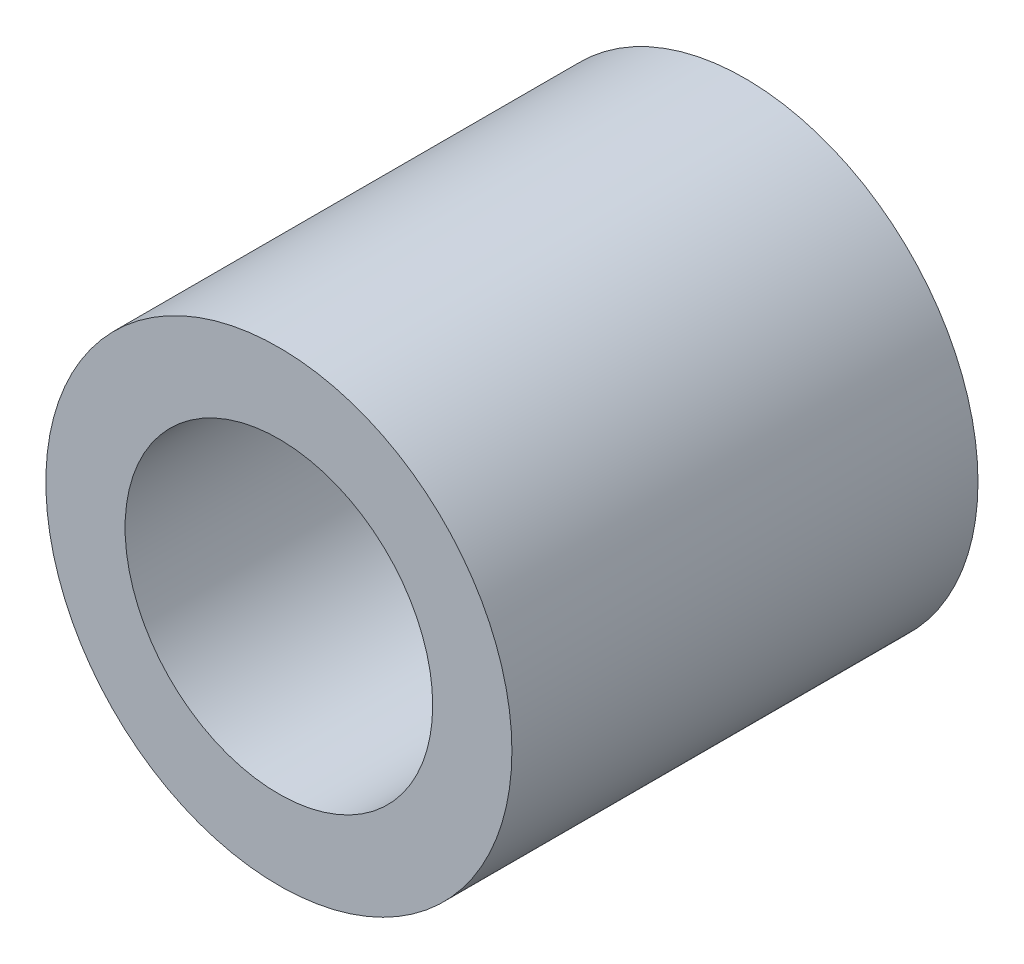
ISO-10303-21;
HEADER;
FILE_DESCRIPTION(('STEP AP214'),'2;1');
FILE_NAME('part.step','',(''),(''),'','','');
FILE_SCHEMA(('AUTOMOTIVE_DESIGN { 1 0 10303 214 1 1 1 1 }'));
ENDSEC;
DATA;
#1=APPLICATION_CONTEXT('core data for automotive mechanical design processes');
#2=APPLICATION_PROTOCOL_DEFINITION('international standard','automotive_design',2000,#1);
#3=PRODUCT_CONTEXT('',#1,'mechanical');
#4=PRODUCT('Part','Part','',(#3));
#5=PRODUCT_RELATED_PRODUCT_CATEGORY('part','',(#4));
#6=PRODUCT_DEFINITION_FORMATION('','',#4);
#7=PRODUCT_DEFINITION_CONTEXT('part definition',#1,'design');
#8=PRODUCT_DEFINITION('design','',#6,#7);
#9=PRODUCT_DEFINITION_SHAPE('','',#8);
#10=(LENGTH_UNIT() NAMED_UNIT(*) SI_UNIT(.MILLI.,.METRE.));
#11=(NAMED_UNIT(*) PLANE_ANGLE_UNIT() SI_UNIT($,.RADIAN.));
#12=(NAMED_UNIT(*) SI_UNIT($,.STERADIAN.) SOLID_ANGLE_UNIT());
#13=UNCERTAINTY_MEASURE_WITH_UNIT(LENGTH_MEASURE(1.E-05),#10,'distance_accuracy_value','');
#14=(GEOMETRIC_REPRESENTATION_CONTEXT(3) GLOBAL_UNCERTAINTY_ASSIGNED_CONTEXT((#13)) GLOBAL_UNIT_ASSIGNED_CONTEXT((#10,
#11,#12)) REPRESENTATION_CONTEXT('',''));
#15=CARTESIAN_POINT('',(0.,0.,0.));
#16=DIRECTION('',(0.,0.,1.));
#17=DIRECTION('',(1.,0.,0.));
#18=AXIS2_PLACEMENT_3D('',#15,#16,#17);
#19=CARTESIAN_POINT('',(0.,0.,50.));
#20=DIRECTION('',(0.,0.,1.));
#21=DIRECTION('',(1.,0.,0.));
#22=AXIS2_PLACEMENT_3D('',#19,#20,#21);
#23=PLANE('',#22);
#24=CARTESIAN_POINT('',(0.,0.,50.));
#25=DIRECTION('',(0.,0.,1.));
#26=DIRECTION('',(1.,0.,0.));
#27=AXIS2_PLACEMENT_3D('',#24,#25,#26);
#28=CIRCLE('',#27,25.);
#29=CARTESIAN_POINT('',(25.,0.,50.));
#30=VERTEX_POINT('',#29);
#31=EDGE_CURVE('E10',#30,#30,#28,.T.);
#32=ORIENTED_EDGE('',*,*,#31,.T.);
#33=EDGE_LOOP('',(#32));
#34=FACE_BOUND('',#33,.T.);
#35=CARTESIAN_POINT('',(0.,0.,50.));
#36=DIRECTION('',(0.,0.,1.));
#37=DIRECTION('',(1.,0.,0.));
#38=AXIS2_PLACEMENT_3D('',#35,#36,#37);
#39=CIRCLE('',#38,16.5);
#40=CARTESIAN_POINT('',(16.5,0.,50.));
#41=VERTEX_POINT('',#40);
#42=EDGE_CURVE('E50',#41,#41,#39,.T.);
#43=ORIENTED_EDGE('',*,*,#42,.F.);
#44=EDGE_LOOP('',(#43));
#45=FACE_BOUND('',#44,.T.);
#46=ADVANCED_FACE('F37',(#34,#45),#23,.T.);
#47=CARTESIAN_POINT('',(0.,0.,0.));
#48=DIRECTION('',(0.,0.,1.));
#49=DIRECTION('',(1.,0.,0.));
#50=AXIS2_PLACEMENT_3D('',#47,#48,#49);
#51=PLANE('',#50);
#52=CARTESIAN_POINT('',(0.,0.,0.));
#53=DIRECTION('',(0.,0.,1.));
#54=DIRECTION('',(1.,0.,0.));
#55=AXIS2_PLACEMENT_3D('',#52,#53,#54);
#56=CIRCLE('',#55,25.);
#57=CARTESIAN_POINT('',(25.,0.,0.));
#58=VERTEX_POINT('',#57);
#59=EDGE_CURVE('E41',#58,#58,#56,.T.);
#60=ORIENTED_EDGE('',*,*,#59,.F.);
#61=EDGE_LOOP('',(#60));
#62=FACE_BOUND('',#61,.T.);
#63=CARTESIAN_POINT('',(0.,0.,0.));
#64=DIRECTION('',(0.,0.,1.));
#65=DIRECTION('',(1.,0.,0.));
#66=AXIS2_PLACEMENT_3D('',#63,#64,#65);
#67=CIRCLE('',#66,16.5);
#68=CARTESIAN_POINT('',(16.5,0.,0.));
#69=VERTEX_POINT('',#68);
#70=EDGE_CURVE('E52',#69,#69,#67,.T.);
#71=ORIENTED_EDGE('',*,*,#70,.T.);
#72=EDGE_LOOP('',(#71));
#73=FACE_BOUND('',#72,.T.);
#74=ADVANCED_FACE('F64',(#62,#73),#51,.F.);
#75=CARTESIAN_POINT('',(0.,0.,50.));
#76=DIRECTION('',(0.,0.,-1.));
#77=DIRECTION('',(-1.,0.,0.));
#78=AXIS2_PLACEMENT_3D('',#75,#76,#77);
#79=CYLINDRICAL_SURFACE('',#78,25.);
#80=ORIENTED_EDGE('',*,*,#31,.F.);
#81=EDGE_LOOP('',(#80));
#82=FACE_BOUND('',#81,.T.);
#83=ORIENTED_EDGE('',*,*,#59,.T.);
#84=EDGE_LOOP('',(#83));
#85=FACE_BOUND('',#84,.T.);
#86=ADVANCED_FACE('F39',(#82,#85),#79,.T.);
#87=CARTESIAN_POINT('',(0.,0.,50.));
#88=DIRECTION('',(0.,0.,-1.));
#89=DIRECTION('',(-1.,0.,0.));
#90=AXIS2_PLACEMENT_3D('',#87,#88,#89);
#91=CYLINDRICAL_SURFACE('',#90,16.5);
#92=ORIENTED_EDGE('',*,*,#42,.T.);
#93=EDGE_LOOP('',(#92));
#94=FACE_BOUND('',#93,.T.);
#95=ORIENTED_EDGE('',*,*,#70,.F.);
#96=EDGE_LOOP('',(#95));
#97=FACE_BOUND('',#96,.T.);
#98=ADVANCED_FACE('F60',(#94,#97),#91,.F.);
#99=CLOSED_SHELL('',(#46,#74,#86,#98));
#100=MANIFOLD_SOLID_BREP('B2',#99);
#101=ADVANCED_BREP_SHAPE_REPRESENTATION('',(#18,#100),#14);
#102=SHAPE_DEFINITION_REPRESENTATION(#9,#101);
ENDSEC;
END-ISO-10303-21;
